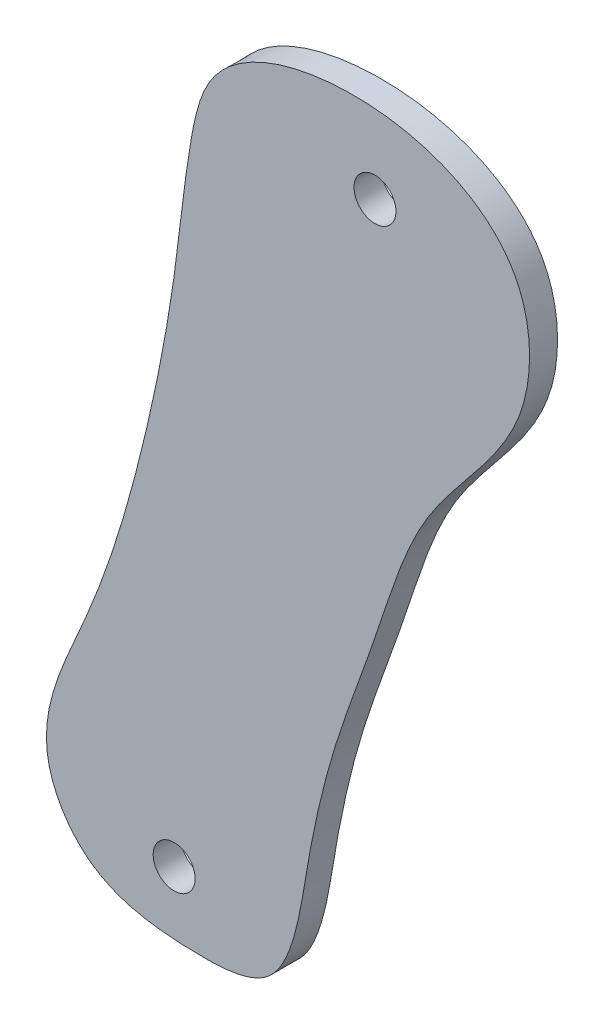
ISO-10303-21;
HEADER;
FILE_DESCRIPTION(('STEP AP214'),'2;1');
FILE_NAME('part.step','',(''),(''),'','','');
FILE_SCHEMA(('AUTOMOTIVE_DESIGN { 1 0 10303 214 1 1 1 1 }'));
ENDSEC;
DATA;
#1=APPLICATION_CONTEXT('core data for automotive mechanical design processes');
#2=APPLICATION_PROTOCOL_DEFINITION('international standard','automotive_design',2000,#1);
#3=PRODUCT_CONTEXT('',#1,'mechanical');
#4=PRODUCT('Part','Part','',(#3));
#5=PRODUCT_RELATED_PRODUCT_CATEGORY('part','',(#4));
#6=PRODUCT_DEFINITION_FORMATION('','',#4);
#7=PRODUCT_DEFINITION_CONTEXT('part definition',#1,'design');
#8=PRODUCT_DEFINITION('design','',#6,#7);
#9=PRODUCT_DEFINITION_SHAPE('','',#8);
#10=(LENGTH_UNIT() NAMED_UNIT(*) SI_UNIT(.MILLI.,.METRE.));
#11=(NAMED_UNIT(*) PLANE_ANGLE_UNIT() SI_UNIT($,.RADIAN.));
#12=(NAMED_UNIT(*) SI_UNIT($,.STERADIAN.) SOLID_ANGLE_UNIT());
#13=UNCERTAINTY_MEASURE_WITH_UNIT(LENGTH_MEASURE(1.E-05),#10,'distance_accuracy_value','');
#14=(GEOMETRIC_REPRESENTATION_CONTEXT(3) GLOBAL_UNCERTAINTY_ASSIGNED_CONTEXT((#13)) GLOBAL_UNIT_ASSIGNED_CONTEXT((#10,
#11,#12)) REPRESENTATION_CONTEXT('',''));
#15=CARTESIAN_POINT('',(0.,0.,0.));
#16=DIRECTION('',(0.,0.,1.));
#17=DIRECTION('',(1.,0.,0.));
#18=AXIS2_PLACEMENT_3D('',#15,#16,#17);
#19=CARTESIAN_POINT('',(476.090743033962,73.295560777503,3.73351095032719));
#20=DIRECTION('',(0.,0.,-1.));
#21=DIRECTION('',(-1.,0.,0.));
#22=AXIS2_PLACEMENT_3D('',#19,#20,#21);
#23=PLANE('',#22);
#24=CARTESIAN_POINT('',(460.504535762227,63.1456438392513,3.73351095032719));
#25=DIRECTION('',(0.,0.,1.));
#26=DIRECTION('',(1.,0.,0.));
#27=AXIS2_PLACEMENT_3D('',#24,#25,#26);
#28=CIRCLE('',#27,2.38125);
#29=CARTESIAN_POINT('',(462.885785762226,63.1456438392513,3.73351095032719));
#30=VERTEX_POINT('',#29);
#31=EDGE_CURVE('E60',#30,#30,#28,.T.);
#32=ORIENTED_EDGE('',*,*,#31,.F.);
#33=EDGE_LOOP('',(#32));
#34=FACE_BOUND('',#33,.T.);
#35=CARTESIAN_POINT('',(483.292211175107,140.123522977883,3.73351095032719));
#36=DIRECTION('',(0.,0.,1.));
#37=DIRECTION('',(1.,0.,0.));
#38=AXIS2_PLACEMENT_3D('',#35,#36,#37);
#39=CIRCLE('',#38,2.38125);
#40=CARTESIAN_POINT('',(485.673461175107,140.123522977883,3.73351095032719));
#41=VERTEX_POINT('',#40);
#42=EDGE_CURVE('E51',#41,#41,#39,.T.);
#43=ORIENTED_EDGE('',*,*,#42,.F.);
#44=EDGE_LOOP('',(#43));
#45=FACE_BOUND('',#44,.T.);
#46=CARTESIAN_POINT('',(462.449825126741,135.677147287565,3.73351095032719));
#47=CARTESIAN_POINT('',(461.587865052894,130.775098827628,3.73351095032719));
#48=CARTESIAN_POINT('',(460.617076971566,119.831736909147,3.73351095032719));
#49=CARTESIAN_POINT('',(456.936379760455,101.524151411658,3.73351095032719));
#50=CARTESIAN_POINT('',(451.693622016731,83.8608461352676,3.73351095032719));
#51=CARTESIAN_POINT('',(443.668988357375,68.6432205213624,3.73351095032719));
#52=CARTESIAN_POINT('',(450.949797614846,56.9957110410833,3.73351095032719));
#53=CARTESIAN_POINT('',(461.061572994331,55.6442414936528,3.73351095032719));
#54=CARTESIAN_POINT('',(471.48426732653,56.0235763878876,3.73351095032719));
#55=CARTESIAN_POINT('',(474.524125361848,63.5764821294449,3.73351095032719));
#56=CARTESIAN_POINT('',(475.750845143863,72.2053706353109,3.73351095032719));
#57=CARTESIAN_POINT('',(478.282519491431,83.8186167126029,3.73351095032719));
#58=CARTESIAN_POINT('',(483.715884425126,97.4716240487422,3.73351095032719));
#59=CARTESIAN_POINT('',(488.312528625536,113.722204726804,3.73351095032719));
#60=CARTESIAN_POINT('',(501.347957293044,124.551246804724,3.73351095032719));
#61=CARTESIAN_POINT('',(501.034038371937,145.401913567871,3.73351095032719));
#62=CARTESIAN_POINT('',(480.52844413852,151.7293835265,3.73351095032719));
#63=CARTESIAN_POINT('',(464.447185721973,145.40933942374,3.73351095032719));
#64=CARTESIAN_POINT('',(462.844780442291,137.923295520042,3.73351095032719));
#65=CARTESIAN_POINT('',(462.449825126741,135.677147287565,3.73351095032719));
#66=B_SPLINE_CURVE_WITH_KNOTS('',3,(#46,#47,#48,#49,#50,#51,#52,#53,#54,#55,#56,#57,#58,#59,#60,
#61,#62,#63,#64,#65),.UNSPECIFIED.,.T.,.F.,(4,1,1,1,1,1,1,1,1,1,1,1,1,1,1,1,1,4),(0.,
0.0620750338244166,0.142819654990747,0.234856838242213,0.305446135468217,0.338929579117934,
0.391745822532349,0.430499571359021,0.455901361390384,0.486064083815887,0.544323983251829,
0.605684639988826,0.674669425401719,0.755716834552977,0.807826072753403,0.906476727919787,
0.971556844318207,1.),.UNSPECIFIED.);
#67=CARTESIAN_POINT('',(462.449825126741,135.677147287565,3.73351095032719));
#68=VERTEX_POINT('',#67);
#69=EDGE_CURVE('E10',#68,#68,#66,.T.);
#70=ORIENTED_EDGE('',*,*,#69,.T.);
#71=EDGE_LOOP('',(#70));
#72=FACE_BOUND('',#71,.T.);
#73=ADVANCED_FACE('F33',(#34,#45,#72),#23,.F.);
#74=CARTESIAN_POINT('',(476.090743033962,73.295560777503,0.558510950685095));
#75=DIRECTION('',(0.,0.,-1.));
#76=DIRECTION('',(-1.,0.,0.));
#77=AXIS2_PLACEMENT_3D('',#74,#75,#76);
#78=PLANE('',#77);
#79=CARTESIAN_POINT('',(460.504535762227,63.1456438392513,0.558510950685095));
#80=DIRECTION('',(0.,0.,1.));
#81=DIRECTION('',(1.,0.,0.));
#82=AXIS2_PLACEMENT_3D('',#79,#80,#81);
#83=CIRCLE('',#82,2.38125);
#84=CARTESIAN_POINT('',(462.885785762226,63.1456438392513,0.558510950685095));
#85=VERTEX_POINT('',#84);
#86=EDGE_CURVE('E57',#85,#85,#83,.T.);
#87=ORIENTED_EDGE('',*,*,#86,.T.);
#88=EDGE_LOOP('',(#87));
#89=FACE_BOUND('',#88,.T.);
#90=CARTESIAN_POINT('',(483.292211175107,140.123522977883,0.558510950685095));
#91=DIRECTION('',(0.,0.,1.));
#92=DIRECTION('',(1.,0.,0.));
#93=AXIS2_PLACEMENT_3D('',#90,#91,#92);
#94=CIRCLE('',#93,2.38125);
#95=CARTESIAN_POINT('',(485.673461175107,140.123522977883,0.558510950685095));
#96=VERTEX_POINT('',#95);
#97=EDGE_CURVE('E46',#96,#96,#94,.T.);
#98=ORIENTED_EDGE('',*,*,#97,.T.);
#99=EDGE_LOOP('',(#98));
#100=FACE_BOUND('',#99,.T.);
#101=CARTESIAN_POINT('',(462.449825126741,135.677147287565,0.558510950685095));
#102=CARTESIAN_POINT('',(461.587865052894,130.775098827628,0.558510950685095));
#103=CARTESIAN_POINT('',(460.617076971566,119.831736909147,0.558510950685095));
#104=CARTESIAN_POINT('',(456.936379760455,101.524151411658,0.558510950685095));
#105=CARTESIAN_POINT('',(451.693622016731,83.8608461352676,0.558510950685095));
#106=CARTESIAN_POINT('',(443.668988357375,68.6432205213624,0.558510950685095));
#107=CARTESIAN_POINT('',(450.949797614846,56.9957110410833,0.558510950685095));
#108=CARTESIAN_POINT('',(461.061572994331,55.6442414936528,0.558510950685095));
#109=CARTESIAN_POINT('',(471.48426732653,56.0235763878876,0.558510950685095));
#110=CARTESIAN_POINT('',(474.524125361848,63.5764821294449,0.558510950685095));
#111=CARTESIAN_POINT('',(475.750845143863,72.2053706353109,0.558510950685095));
#112=CARTESIAN_POINT('',(478.282519491431,83.8186167126029,0.558510950685095));
#113=CARTESIAN_POINT('',(483.715884425126,97.4716240487422,0.558510950685095));
#114=CARTESIAN_POINT('',(488.312528625536,113.722204726804,0.558510950685095));
#115=CARTESIAN_POINT('',(501.347957293044,124.551246804724,0.558510950685095));
#116=CARTESIAN_POINT('',(501.034038371937,145.401913567871,0.558510950685095));
#117=CARTESIAN_POINT('',(480.52844413852,151.7293835265,0.558510950685095));
#118=CARTESIAN_POINT('',(464.447185721973,145.40933942374,0.558510950685095));
#119=CARTESIAN_POINT('',(462.844780442291,137.923295520042,0.558510950685095));
#120=CARTESIAN_POINT('',(462.449825126741,135.677147287565,0.558510950685095));
#121=B_SPLINE_CURVE_WITH_KNOTS('',3,(#101,#102,#103,#104,#105,#106,#107,#108,#109,#110,#111,
#112,#113,#114,#115,#116,#117,#118,#119,#120),.UNSPECIFIED.,.T.,.F.,(4,1,1,1,1,1,1,1,1,1,1,1,1,
1,1,1,1,4),(0.,0.0620750338244166,0.142819654990747,0.234856838242213,0.305446135468217,
0.338929579117934,0.391745822532349,0.430499571359021,0.455901361390384,0.486064083815887,
0.544323983251829,0.605684639988826,0.674669425401719,0.755716834552977,0.807826072753403,
0.906476727919787,0.971556844318207,1.),.UNSPECIFIED.);
#122=CARTESIAN_POINT('',(462.449825126741,135.677147287565,0.558510950685095));
#123=VERTEX_POINT('',#122);
#124=EDGE_CURVE('E38',#123,#123,#121,.T.);
#125=ORIENTED_EDGE('',*,*,#124,.F.);
#126=EDGE_LOOP('',(#125));
#127=FACE_BOUND('',#126,.T.);
#128=ADVANCED_FACE('F66',(#89,#100,#127),#78,.T.);
#129=DIRECTION('',(0.,0.,-1.));
#130=VECTOR('',#129,1.);
#131=SURFACE_OF_LINEAR_EXTRUSION('',#66,#130);
#132=ORIENTED_EDGE('',*,*,#69,.F.);
#133=EDGE_LOOP('',(#132));
#134=FACE_BOUND('',#133,.T.);
#135=ORIENTED_EDGE('',*,*,#124,.T.);
#136=EDGE_LOOP('',(#135));
#137=FACE_BOUND('',#136,.T.);
#138=ADVANCED_FACE('F35',(#134,#137),#131,.F.);
#139=CARTESIAN_POINT('',(483.292211175107,140.123522977883,0.558510950685095));
#140=DIRECTION('',(0.,0.,1.));
#141=DIRECTION('',(1.,0.,0.));
#142=AXIS2_PLACEMENT_3D('',#139,#140,#141);
#143=CYLINDRICAL_SURFACE('',#142,2.38125);
#144=CARTESIAN_POINT('',(485.673461175107,140.123522977883,0.558510950685095));
#145=CARTESIAN_POINT('',(485.673461175107,140.123522977883,0.591583867348034));
#146=CARTESIAN_POINT('',(485.673461175107,140.123522977883,0.624656784010972));
#147=CARTESIAN_POINT('',(485.673461175107,140.123522977883,0.690802617336849));
#148=CARTESIAN_POINT('',(485.673461175107,140.123522977883,0.723875533999787));
#149=CARTESIAN_POINT('',(485.673461175107,140.123522977883,0.790021367325664));
#150=CARTESIAN_POINT('',(485.673461175107,140.123522977883,0.823094283988603));
#151=CARTESIAN_POINT('',(485.673461175107,140.123522977883,0.889240117314479));
#152=CARTESIAN_POINT('',(485.673461175107,140.123522977883,0.922313033977418));
#153=CARTESIAN_POINT('',(485.673461175107,140.123522977883,0.988458867303295));
#154=CARTESIAN_POINT('',(485.673461175107,140.123522977883,1.02153178396623));
#155=CARTESIAN_POINT('',(485.673461175107,140.123522977883,1.08767761729211));
#156=CARTESIAN_POINT('',(485.673461175107,140.123522977883,1.12075053395505));
#157=CARTESIAN_POINT('',(485.673461175107,140.123522977883,1.18689636728093));
#158=CARTESIAN_POINT('',(485.673461175107,140.123522977883,1.21996928394386));
#159=CARTESIAN_POINT('',(485.673461175107,140.123522977883,1.28611511726974));
#160=CARTESIAN_POINT('',(485.673461175107,140.123522977883,1.31918803393268));
#161=CARTESIAN_POINT('',(485.673461175107,140.123522977883,1.38533386725856));
#162=CARTESIAN_POINT('',(485.673461175107,140.123522977883,1.41840678392149));
#163=CARTESIAN_POINT('',(485.673461175107,140.123522977883,1.48455261724737));
#164=CARTESIAN_POINT('',(485.673461175107,140.123522977883,1.51762553391031));
#165=CARTESIAN_POINT('',(485.673461175107,140.123522977883,1.58377136723619));
#166=CARTESIAN_POINT('',(485.673461175107,140.123522977883,1.61684428389913));
#167=CARTESIAN_POINT('',(485.673461175107,140.123522977883,1.682990117225));
#168=CARTESIAN_POINT('',(485.673461175107,140.123522977883,1.71606303388794));
#169=CARTESIAN_POINT('',(485.673461175107,140.123522977883,1.78220886721382));
#170=CARTESIAN_POINT('',(485.673461175107,140.123522977883,1.81528178387676));
#171=CARTESIAN_POINT('',(485.673461175107,140.123522977883,1.88142761720263));
#172=CARTESIAN_POINT('',(485.673461175107,140.123522977883,1.91450053386557));
#173=CARTESIAN_POINT('',(485.673461175107,140.123522977883,1.98064636719145));
#174=CARTESIAN_POINT('',(485.673461175107,140.123522977883,2.01371928385439));
#175=CARTESIAN_POINT('',(485.673461175107,140.123522977883,2.07986511718026));
#176=CARTESIAN_POINT('',(485.673461175107,140.123522977883,2.1129380338432));
#177=CARTESIAN_POINT('',(485.673461175107,140.123522977883,2.17908386716908));
#178=CARTESIAN_POINT('',(485.673461175107,140.123522977883,2.21215678383202));
#179=CARTESIAN_POINT('',(485.673461175107,140.123522977883,2.27830261715789));
#180=CARTESIAN_POINT('',(485.673461175107,140.123522977883,2.31137553382083));
#181=CARTESIAN_POINT('',(485.673461175107,140.123522977883,2.37752136714671));
#182=CARTESIAN_POINT('',(485.673461175107,140.123522977883,2.41059428380965));
#183=CARTESIAN_POINT('',(485.673461175107,140.123522977883,2.47674011713552));
#184=CARTESIAN_POINT('',(485.673461175107,140.123522977883,2.50981303379846));
#185=CARTESIAN_POINT('',(485.673461175107,140.123522977883,2.57595886712434));
#186=CARTESIAN_POINT('',(485.673461175107,140.123522977883,2.60903178378728));
#187=CARTESIAN_POINT('',(485.673461175107,140.123522977883,2.67517761711316));
#188=CARTESIAN_POINT('',(485.673461175107,140.123522977883,2.70825053377609));
#189=CARTESIAN_POINT('',(485.673461175107,140.123522977883,2.77439636710197));
#190=CARTESIAN_POINT('',(485.673461175107,140.123522977883,2.80746928376491));
#191=CARTESIAN_POINT('',(485.673461175107,140.123522977883,2.87361511709079));
#192=CARTESIAN_POINT('',(485.673461175107,140.123522977883,2.90668803375372));
#193=CARTESIAN_POINT('',(485.673461175107,140.123522977883,2.9728338670796));
#194=CARTESIAN_POINT('',(485.673461175107,140.123522977883,3.00590678374254));
#195=CARTESIAN_POINT('',(485.673461175107,140.123522977883,3.07205261706842));
#196=CARTESIAN_POINT('',(485.673461175107,140.123522977883,3.10512553373135));
#197=CARTESIAN_POINT('',(485.673461175107,140.123522977883,3.17127136705723));
#198=CARTESIAN_POINT('',(485.673461175107,140.123522977883,3.20434428372017));
#199=CARTESIAN_POINT('',(485.673461175107,140.123522977883,3.27049011704605));
#200=CARTESIAN_POINT('',(485.673461175107,140.123522977883,3.30356303370899));
#201=CARTESIAN_POINT('',(485.673461175107,140.123522977883,3.36970886703486));
#202=CARTESIAN_POINT('',(485.673461175107,140.123522977883,3.4027817836978));
#203=CARTESIAN_POINT('',(485.673461175107,140.123522977883,3.46892761702368));
#204=CARTESIAN_POINT('',(485.673461175107,140.123522977883,3.50200053368662));
#205=CARTESIAN_POINT('',(485.673461175107,140.123522977883,3.56814636701249));
#206=CARTESIAN_POINT('',(485.673461175107,140.123522977883,3.60121928367543));
#207=CARTESIAN_POINT('',(485.673461175107,140.123522977883,3.66736511700131));
#208=CARTESIAN_POINT('',(485.673461175107,140.123522977883,3.70043803366425));
#209=CARTESIAN_POINT('',(485.673461175107,140.123522977883,3.73351095032719));
#210=B_SPLINE_CURVE_WITH_KNOTS('',3,(#144,#145,#146,#147,#148,#149,#150,#151,#152,#153,#154,
#155,#156,#157,#158,#159,#160,#161,#162,#163,#164,#165,#166,#167,#168,#169,#170,#171,#172,#173,
#174,#175,#176,#177,#178,#179,#180,#181,#182,#183,#184,#185,#186,#187,#188,#189,#190,#191,#192,
#193,#194,#195,#196,#197,#198,#199,#200,#201,#202,#203,#204,#205,#206,#207,#208,#209),
.UNSPECIFIED.,.F.,.F.,(4,2,2,2,2,2,2,2,2,2,2,2,2,2,2,2,2,2,2,2,2,2,2,2,2,2,2,2,2,2,2,2,4),(0.,
0.0992187499888153,0.198437499977631,0.297656249966446,0.396874999955261,0.496093749944076,
0.595312499932892,0.694531249921707,0.793749999910523,0.892968749899338,0.992187499888153,
1.09140624987697,1.19062499986578,1.2898437498546,1.38906249984341,1.48828124983223,
1.58749999982105,1.68671874980986,1.78593749979868,1.88515624978749,1.98437499977631,
2.08359374976512,2.18281249975394,2.28203124974275,2.38124999973157,2.48046874972038,
2.5796874997092,2.67890624969801,2.77812499968683,2.87734374967564,2.97656249966446,
3.07578124965328,3.17499999964209),.UNSPECIFIED.);
#211=EDGE_CURVE('BSEAM72',#96,#41,#210,.T.);
#212=ORIENTED_EDGE('',*,*,#97,.F.);
#213=ORIENTED_EDGE('',*,*,#42,.T.);
#214=ORIENTED_EDGE('',*,*,#211,.T.);
#215=ORIENTED_EDGE('',*,*,#211,.F.);
#216=EDGE_LOOP('',(#212,#214,#213,#215));
#217=FACE_BOUND('',#216,.T.);
#218=ADVANCED_FACE('F72',(#217),#143,.F.);
#219=CARTESIAN_POINT('',(460.504535762227,63.1456438392513,0.558510950685095));
#220=DIRECTION('',(0.,0.,1.));
#221=DIRECTION('',(1.,0.,0.));
#222=AXIS2_PLACEMENT_3D('',#219,#220,#221);
#223=CYLINDRICAL_SURFACE('',#222,2.38125);
#224=CARTESIAN_POINT('',(462.885785762226,63.1456438392513,0.558510950685095));
#225=CARTESIAN_POINT('',(462.885785762226,63.1456438392513,0.591583867348034));
#226=CARTESIAN_POINT('',(462.885785762226,63.1456438392513,0.624656784010972));
#227=CARTESIAN_POINT('',(462.885785762226,63.1456438392513,0.690802617336849));
#228=CARTESIAN_POINT('',(462.885785762226,63.1456438392513,0.723875533999787));
#229=CARTESIAN_POINT('',(462.885785762226,63.1456438392513,0.790021367325664));
#230=CARTESIAN_POINT('',(462.885785762226,63.1456438392513,0.823094283988603));
#231=CARTESIAN_POINT('',(462.885785762226,63.1456438392513,0.889240117314479));
#232=CARTESIAN_POINT('',(462.885785762226,63.1456438392513,0.922313033977418));
#233=CARTESIAN_POINT('',(462.885785762226,63.1456438392513,0.988458867303295));
#234=CARTESIAN_POINT('',(462.885785762226,63.1456438392513,1.02153178396623));
#235=CARTESIAN_POINT('',(462.885785762226,63.1456438392513,1.08767761729211));
#236=CARTESIAN_POINT('',(462.885785762226,63.1456438392513,1.12075053395505));
#237=CARTESIAN_POINT('',(462.885785762226,63.1456438392513,1.18689636728093));
#238=CARTESIAN_POINT('',(462.885785762226,63.1456438392513,1.21996928394386));
#239=CARTESIAN_POINT('',(462.885785762226,63.1456438392513,1.28611511726974));
#240=CARTESIAN_POINT('',(462.885785762226,63.1456438392513,1.31918803393268));
#241=CARTESIAN_POINT('',(462.885785762226,63.1456438392513,1.38533386725856));
#242=CARTESIAN_POINT('',(462.885785762226,63.1456438392513,1.41840678392149));
#243=CARTESIAN_POINT('',(462.885785762226,63.1456438392513,1.48455261724737));
#244=CARTESIAN_POINT('',(462.885785762226,63.1456438392513,1.51762553391031));
#245=CARTESIAN_POINT('',(462.885785762226,63.1456438392513,1.58377136723619));
#246=CARTESIAN_POINT('',(462.885785762226,63.1456438392513,1.61684428389913));
#247=CARTESIAN_POINT('',(462.885785762226,63.1456438392513,1.682990117225));
#248=CARTESIAN_POINT('',(462.885785762226,63.1456438392513,1.71606303388794));
#249=CARTESIAN_POINT('',(462.885785762226,63.1456438392513,1.78220886721382));
#250=CARTESIAN_POINT('',(462.885785762226,63.1456438392513,1.81528178387676));
#251=CARTESIAN_POINT('',(462.885785762226,63.1456438392513,1.88142761720263));
#252=CARTESIAN_POINT('',(462.885785762226,63.1456438392513,1.91450053386557));
#253=CARTESIAN_POINT('',(462.885785762226,63.1456438392513,1.98064636719145));
#254=CARTESIAN_POINT('',(462.885785762226,63.1456438392513,2.01371928385439));
#255=CARTESIAN_POINT('',(462.885785762226,63.1456438392513,2.07986511718026));
#256=CARTESIAN_POINT('',(462.885785762226,63.1456438392513,2.1129380338432));
#257=CARTESIAN_POINT('',(462.885785762226,63.1456438392513,2.17908386716908));
#258=CARTESIAN_POINT('',(462.885785762226,63.1456438392513,2.21215678383202));
#259=CARTESIAN_POINT('',(462.885785762226,63.1456438392513,2.27830261715789));
#260=CARTESIAN_POINT('',(462.885785762226,63.1456438392513,2.31137553382083));
#261=CARTESIAN_POINT('',(462.885785762226,63.1456438392513,2.37752136714671));
#262=CARTESIAN_POINT('',(462.885785762226,63.1456438392513,2.41059428380965));
#263=CARTESIAN_POINT('',(462.885785762226,63.1456438392513,2.47674011713552));
#264=CARTESIAN_POINT('',(462.885785762226,63.1456438392513,2.50981303379846));
#265=CARTESIAN_POINT('',(462.885785762226,63.1456438392513,2.57595886712434));
#266=CARTESIAN_POINT('',(462.885785762226,63.1456438392513,2.60903178378728));
#267=CARTESIAN_POINT('',(462.885785762226,63.1456438392513,2.67517761711316));
#268=CARTESIAN_POINT('',(462.885785762226,63.1456438392513,2.70825053377609));
#269=CARTESIAN_POINT('',(462.885785762226,63.1456438392513,2.77439636710197));
#270=CARTESIAN_POINT('',(462.885785762226,63.1456438392513,2.80746928376491));
#271=CARTESIAN_POINT('',(462.885785762226,63.1456438392513,2.87361511709079));
#272=CARTESIAN_POINT('',(462.885785762226,63.1456438392513,2.90668803375372));
#273=CARTESIAN_POINT('',(462.885785762226,63.1456438392513,2.9728338670796));
#274=CARTESIAN_POINT('',(462.885785762226,63.1456438392513,3.00590678374254));
#275=CARTESIAN_POINT('',(462.885785762226,63.1456438392513,3.07205261706842));
#276=CARTESIAN_POINT('',(462.885785762226,63.1456438392513,3.10512553373135));
#277=CARTESIAN_POINT('',(462.885785762226,63.1456438392513,3.17127136705723));
#278=CARTESIAN_POINT('',(462.885785762226,63.1456438392513,3.20434428372017));
#279=CARTESIAN_POINT('',(462.885785762226,63.1456438392513,3.27049011704605));
#280=CARTESIAN_POINT('',(462.885785762226,63.1456438392513,3.30356303370899));
#281=CARTESIAN_POINT('',(462.885785762226,63.1456438392513,3.36970886703486));
#282=CARTESIAN_POINT('',(462.885785762226,63.1456438392513,3.4027817836978));
#283=CARTESIAN_POINT('',(462.885785762226,63.1456438392513,3.46892761702368));
#284=CARTESIAN_POINT('',(462.885785762226,63.1456438392513,3.50200053368662));
#285=CARTESIAN_POINT('',(462.885785762226,63.1456438392513,3.56814636701249));
#286=CARTESIAN_POINT('',(462.885785762226,63.1456438392513,3.60121928367543));
#287=CARTESIAN_POINT('',(462.885785762226,63.1456438392513,3.66736511700131));
#288=CARTESIAN_POINT('',(462.885785762226,63.1456438392513,3.70043803366425));
#289=CARTESIAN_POINT('',(462.885785762226,63.1456438392513,3.73351095032719));
#290=B_SPLINE_CURVE_WITH_KNOTS('',3,(#224,#225,#226,#227,#228,#229,#230,#231,#232,#233,#234,
#235,#236,#237,#238,#239,#240,#241,#242,#243,#244,#245,#246,#247,#248,#249,#250,#251,#252,#253,
#254,#255,#256,#257,#258,#259,#260,#261,#262,#263,#264,#265,#266,#267,#268,#269,#270,#271,#272,
#273,#274,#275,#276,#277,#278,#279,#280,#281,#282,#283,#284,#285,#286,#287,#288,#289),
.UNSPECIFIED.,.F.,.F.,(4,2,2,2,2,2,2,2,2,2,2,2,2,2,2,2,2,2,2,2,2,2,2,2,2,2,2,2,2,2,2,2,4),(0.,
0.0992187499888153,0.198437499977631,0.297656249966446,0.396874999955261,0.496093749944076,
0.595312499932892,0.694531249921707,0.793749999910523,0.892968749899338,0.992187499888153,
1.09140624987697,1.19062499986578,1.2898437498546,1.38906249984341,1.48828124983223,
1.58749999982105,1.68671874980986,1.78593749979868,1.88515624978749,1.98437499977631,
2.08359374976512,2.18281249975394,2.28203124974275,2.38124999973157,2.48046874972038,
2.5796874997092,2.67890624969801,2.77812499968683,2.87734374967564,2.97656249966446,
3.07578124965328,3.17499999964209),.UNSPECIFIED.);
#291=EDGE_CURVE('BSEAM69',#85,#30,#290,.T.);
#292=ORIENTED_EDGE('',*,*,#86,.F.);
#293=ORIENTED_EDGE('',*,*,#31,.T.);
#294=ORIENTED_EDGE('',*,*,#291,.T.);
#295=ORIENTED_EDGE('',*,*,#291,.F.);
#296=EDGE_LOOP('',(#292,#294,#293,#295));
#297=FACE_BOUND('',#296,.T.);
#298=ADVANCED_FACE('F69',(#297),#223,.F.);
#299=CLOSED_SHELL('',(#73,#128,#138,#218,#298));
#300=MANIFOLD_SOLID_BREP('B2',#299);
#301=ADVANCED_BREP_SHAPE_REPRESENTATION('',(#18,#300),#14);
#302=SHAPE_DEFINITION_REPRESENTATION(#9,#301);
ENDSEC;
END-ISO-10303-21;
